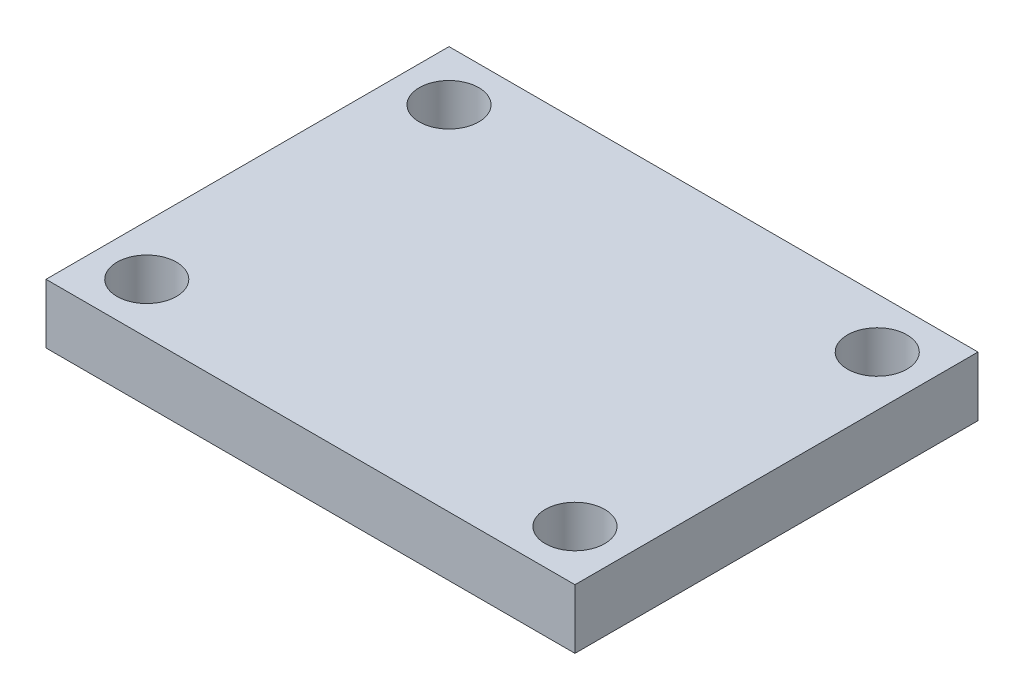
ISO-10303-21;
HEADER;
FILE_DESCRIPTION(('STEP AP214'),'2;1');
FILE_NAME('part.step','',(''),(''),'','','');
FILE_SCHEMA(('AUTOMOTIVE_DESIGN { 1 0 10303 214 1 1 1 1 }'));
ENDSEC;
DATA;
#1=APPLICATION_CONTEXT('core data for automotive mechanical design processes');
#2=APPLICATION_PROTOCOL_DEFINITION('international standard','automotive_design',2000,#1);
#3=PRODUCT_CONTEXT('',#1,'mechanical');
#4=PRODUCT('Part','Part','',(#3));
#5=PRODUCT_RELATED_PRODUCT_CATEGORY('part','',(#4));
#6=PRODUCT_DEFINITION_FORMATION('','',#4);
#7=PRODUCT_DEFINITION_CONTEXT('part definition',#1,'design');
#8=PRODUCT_DEFINITION('design','',#6,#7);
#9=PRODUCT_DEFINITION_SHAPE('','',#8);
#10=(LENGTH_UNIT() NAMED_UNIT(*) SI_UNIT(.MILLI.,.METRE.));
#11=(NAMED_UNIT(*) PLANE_ANGLE_UNIT() SI_UNIT($,.RADIAN.));
#12=(NAMED_UNIT(*) SI_UNIT($,.STERADIAN.) SOLID_ANGLE_UNIT());
#13=UNCERTAINTY_MEASURE_WITH_UNIT(LENGTH_MEASURE(1.E-05),#10,'distance_accuracy_value','');
#14=(GEOMETRIC_REPRESENTATION_CONTEXT(3) GLOBAL_UNCERTAINTY_ASSIGNED_CONTEXT((#13)) GLOBAL_UNIT_ASSIGNED_CONTEXT((#10,
#11,#12)) REPRESENTATION_CONTEXT('',''));
#15=CARTESIAN_POINT('',(0.,0.,0.));
#16=DIRECTION('',(0.,0.,1.));
#17=DIRECTION('',(1.,0.,0.));
#18=AXIS2_PLACEMENT_3D('',#15,#16,#17);
#19=CARTESIAN_POINT('',(0.,3.,-20.32));
#20=DIRECTION('',(0.,0.,-1.));
#21=DIRECTION('',(-1.,0.,0.));
#22=AXIS2_PLACEMENT_3D('',#19,#20,#21);
#23=PLANE('',#22);
#24=DIRECTION('',(1.,0.,0.));
#25=VECTOR('',#24,1.);
#26=CARTESIAN_POINT('',(0.,0.,-20.32));
#27=LINE('',#26,#25);
#28=CARTESIAN_POINT('',(0.,0.,-20.32));
#29=VERTEX_POINT('',#28);
#30=CARTESIAN_POINT('',(26.67,0.,-20.32));
#31=VERTEX_POINT('',#30);
#32=EDGE_CURVE('E98',#29,#31,#27,.T.);
#33=ORIENTED_EDGE('',*,*,#32,.F.);
#34=DIRECTION('',(0.,-1.,0.));
#35=VECTOR('',#34,1.);
#36=CARTESIAN_POINT('',(0.,3.,-20.32));
#37=LINE('',#36,#35);
#38=CARTESIAN_POINT('',(0.,3.,-20.32));
#39=VERTEX_POINT('',#38);
#40=EDGE_CURVE('E11',#39,#29,#37,.T.);
#41=ORIENTED_EDGE('',*,*,#40,.F.);
#42=DIRECTION('',(1.,0.,0.));
#43=VECTOR('',#42,1.);
#44=CARTESIAN_POINT('',(0.,3.,-20.32));
#45=LINE('',#44,#43);
#46=CARTESIAN_POINT('',(26.67,3.,-20.32));
#47=VERTEX_POINT('',#46);
#48=EDGE_CURVE('E91',#39,#47,#45,.T.);
#49=ORIENTED_EDGE('',*,*,#48,.T.);
#50=DIRECTION('',(0.,-1.,0.));
#51=VECTOR('',#50,1.);
#52=CARTESIAN_POINT('',(26.67,3.,-20.32));
#53=LINE('',#52,#51);
#54=EDGE_CURVE('E36',#47,#31,#53,.T.);
#55=ORIENTED_EDGE('',*,*,#54,.T.);
#56=EDGE_LOOP('',(#33,#41,#49,#55));
#57=FACE_BOUND('',#56,.T.);
#58=ADVANCED_FACE('F33',(#57),#23,.T.);
#59=CARTESIAN_POINT('',(0.,3.,0.));
#60=DIRECTION('',(-1.,0.,0.));
#61=DIRECTION('',(0.,0.,1.));
#62=AXIS2_PLACEMENT_3D('',#59,#60,#61);
#63=PLANE('',#62);
#64=DIRECTION('',(0.,0.,-1.));
#65=VECTOR('',#64,1.);
#66=CARTESIAN_POINT('',(0.,0.,0.));
#67=LINE('',#66,#65);
#68=CARTESIAN_POINT('',(0.,0.,0.));
#69=VERTEX_POINT('',#68);
#70=EDGE_CURVE('E93',#69,#29,#67,.T.);
#71=ORIENTED_EDGE('',*,*,#70,.F.);
#72=DIRECTION('',(0.,-1.,0.));
#73=VECTOR('',#72,1.);
#74=CARTESIAN_POINT('',(0.,3.,0.));
#75=LINE('',#74,#73);
#76=CARTESIAN_POINT('',(0.,3.,0.));
#77=VERTEX_POINT('',#76);
#78=EDGE_CURVE('E42',#77,#69,#75,.T.);
#79=ORIENTED_EDGE('',*,*,#78,.F.);
#80=DIRECTION('',(0.,0.,-1.));
#81=VECTOR('',#80,1.);
#82=CARTESIAN_POINT('',(0.,3.,0.));
#83=LINE('',#82,#81);
#84=EDGE_CURVE('E81',#77,#39,#83,.T.);
#85=ORIENTED_EDGE('',*,*,#84,.T.);
#86=ORIENTED_EDGE('',*,*,#40,.T.);
#87=EDGE_LOOP('',(#71,#79,#85,#86));
#88=FACE_BOUND('',#87,.T.);
#89=ADVANCED_FACE('F109',(#88),#63,.T.);
#90=CARTESIAN_POINT('',(0.,3.,0.));
#91=DIRECTION('',(0.,0.,-1.));
#92=DIRECTION('',(-1.,0.,0.));
#93=AXIS2_PLACEMENT_3D('',#90,#91,#92);
#94=PLANE('',#93);
#95=DIRECTION('',(1.,0.,0.));
#96=VECTOR('',#95,1.);
#97=CARTESIAN_POINT('',(0.,0.,0.));
#98=LINE('',#97,#96);
#99=CARTESIAN_POINT('',(26.67,0.,0.));
#100=VERTEX_POINT('',#99);
#101=EDGE_CURVE('E86',#69,#100,#98,.T.);
#102=ORIENTED_EDGE('',*,*,#101,.T.);
#103=DIRECTION('',(0.,-1.,0.));
#104=VECTOR('',#103,1.);
#105=CARTESIAN_POINT('',(26.67,3.,0.));
#106=LINE('',#105,#104);
#107=CARTESIAN_POINT('',(26.67,3.,0.));
#108=VERTEX_POINT('',#107);
#109=EDGE_CURVE('E84',#108,#100,#106,.T.);
#110=ORIENTED_EDGE('',*,*,#109,.F.);
#111=DIRECTION('',(1.,0.,0.));
#112=VECTOR('',#111,1.);
#113=CARTESIAN_POINT('',(0.,3.,0.));
#114=LINE('',#113,#112);
#115=EDGE_CURVE('E78',#77,#108,#114,.T.);
#116=ORIENTED_EDGE('',*,*,#115,.F.);
#117=ORIENTED_EDGE('',*,*,#78,.T.);
#118=EDGE_LOOP('',(#102,#110,#116,#117));
#119=FACE_BOUND('',#118,.T.);
#120=ADVANCED_FACE('F85',(#119),#94,.F.);
#121=CARTESIAN_POINT('',(26.67,3.,0.));
#122=DIRECTION('',(-1.,0.,0.));
#123=DIRECTION('',(0.,0.,1.));
#124=AXIS2_PLACEMENT_3D('',#121,#122,#123);
#125=PLANE('',#124);
#126=DIRECTION('',(0.,0.,-1.));
#127=VECTOR('',#126,1.);
#128=CARTESIAN_POINT('',(26.67,0.,0.));
#129=LINE('',#128,#127);
#130=EDGE_CURVE('E101',#100,#31,#129,.T.);
#131=ORIENTED_EDGE('',*,*,#130,.T.);
#132=ORIENTED_EDGE('',*,*,#54,.F.);
#133=DIRECTION('',(0.,0.,-1.));
#134=VECTOR('',#133,1.);
#135=CARTESIAN_POINT('',(26.67,3.,0.));
#136=LINE('',#135,#134);
#137=EDGE_CURVE('E75',#108,#47,#136,.T.);
#138=ORIENTED_EDGE('',*,*,#137,.F.);
#139=ORIENTED_EDGE('',*,*,#109,.T.);
#140=EDGE_LOOP('',(#131,#132,#138,#139));
#141=FACE_BOUND('',#140,.T.);
#142=ADVANCED_FACE('F90',(#141),#125,.F.);
#143=CARTESIAN_POINT('',(0.,3.,0.));
#144=DIRECTION('',(0.,1.,0.));
#145=DIRECTION('',(0.,0.,1.));
#146=AXIS2_PLACEMENT_3D('',#143,#144,#145);
#147=PLANE('',#146);
#148=CARTESIAN_POINT('',(24.13,3.,-17.78));
#149=DIRECTION('',(0.,1.,0.));
#150=DIRECTION('',(0.,0.,1.));
#151=AXIS2_PLACEMENT_3D('',#148,#149,#150);
#152=CIRCLE('',#151,1.5);
#153=CARTESIAN_POINT('',(24.13,3.,-16.28));
#154=VERTEX_POINT('',#153);
#155=EDGE_CURVE('E169',#154,#154,#152,.T.);
#156=ORIENTED_EDGE('',*,*,#155,.F.);
#157=EDGE_LOOP('',(#156));
#158=FACE_BOUND('',#157,.T.);
#159=CARTESIAN_POINT('',(2.54,3.,-17.78));
#160=DIRECTION('',(0.,1.,0.));
#161=DIRECTION('',(0.,0.,1.));
#162=AXIS2_PLACEMENT_3D('',#159,#160,#161);
#163=CIRCLE('',#162,1.5);
#164=CARTESIAN_POINT('',(2.54,3.,-16.28));
#165=VERTEX_POINT('',#164);
#166=EDGE_CURVE('E161',#165,#165,#163,.T.);
#167=ORIENTED_EDGE('',*,*,#166,.F.);
#168=EDGE_LOOP('',(#167));
#169=FACE_BOUND('',#168,.T.);
#170=CARTESIAN_POINT('',(2.54,3.,-2.54));
#171=DIRECTION('',(0.,1.,0.));
#172=DIRECTION('',(0.,0.,1.));
#173=AXIS2_PLACEMENT_3D('',#170,#171,#172);
#174=CIRCLE('',#173,1.5);
#175=CARTESIAN_POINT('',(2.54,3.,-1.04));
#176=VERTEX_POINT('',#175);
#177=EDGE_CURVE('E154',#176,#176,#174,.T.);
#178=ORIENTED_EDGE('',*,*,#177,.F.);
#179=EDGE_LOOP('',(#178));
#180=FACE_BOUND('',#179,.T.);
#181=CARTESIAN_POINT('',(24.13,3.,-2.54));
#182=DIRECTION('',(0.,1.,0.));
#183=DIRECTION('',(0.,0.,1.));
#184=AXIS2_PLACEMENT_3D('',#181,#182,#183);
#185=CIRCLE('',#184,1.5);
#186=CARTESIAN_POINT('',(24.13,3.,-1.04));
#187=VERTEX_POINT('',#186);
#188=EDGE_CURVE('E158',#187,#187,#185,.T.);
#189=ORIENTED_EDGE('',*,*,#188,.F.);
#190=EDGE_LOOP('',(#189));
#191=FACE_BOUND('',#190,.T.);
#192=ORIENTED_EDGE('',*,*,#48,.F.);
#193=ORIENTED_EDGE('',*,*,#84,.F.);
#194=ORIENTED_EDGE('',*,*,#115,.T.);
#195=ORIENTED_EDGE('',*,*,#137,.T.);
#196=EDGE_LOOP('',(#192,#193,#194,#195));
#197=FACE_BOUND('',#196,.T.);
#198=ADVANCED_FACE('F80',(#158,#169,#180,#191,#197),#147,.T.);
#199=CARTESIAN_POINT('',(0.,0.,0.));
#200=DIRECTION('',(0.,1.,0.));
#201=DIRECTION('',(0.,0.,1.));
#202=AXIS2_PLACEMENT_3D('',#199,#200,#201);
#203=PLANE('',#202);
#204=CARTESIAN_POINT('',(24.13,0.,-17.78));
#205=DIRECTION('',(0.,1.,0.));
#206=DIRECTION('',(0.,0.,1.));
#207=AXIS2_PLACEMENT_3D('',#204,#205,#206);
#208=CIRCLE('',#207,1.5);
#209=CARTESIAN_POINT('',(24.13,0.,-16.28));
#210=VERTEX_POINT('',#209);
#211=EDGE_CURVE('E166',#210,#210,#208,.T.);
#212=ORIENTED_EDGE('',*,*,#211,.T.);
#213=EDGE_LOOP('',(#212));
#214=FACE_BOUND('',#213,.T.);
#215=CARTESIAN_POINT('',(2.54,0.,-17.78));
#216=DIRECTION('',(0.,1.,0.));
#217=DIRECTION('',(0.,0.,1.));
#218=AXIS2_PLACEMENT_3D('',#215,#216,#217);
#219=CIRCLE('',#218,1.5);
#220=CARTESIAN_POINT('',(2.54,0.,-16.28));
#221=VERTEX_POINT('',#220);
#222=EDGE_CURVE('E156',#221,#221,#219,.T.);
#223=ORIENTED_EDGE('',*,*,#222,.T.);
#224=EDGE_LOOP('',(#223));
#225=FACE_BOUND('',#224,.T.);
#226=CARTESIAN_POINT('',(2.54,0.,-2.54));
#227=DIRECTION('',(0.,1.,0.));
#228=DIRECTION('',(0.,0.,1.));
#229=AXIS2_PLACEMENT_3D('',#226,#227,#228);
#230=CIRCLE('',#229,1.5);
#231=CARTESIAN_POINT('',(2.54,0.,-1.04));
#232=VERTEX_POINT('',#231);
#233=EDGE_CURVE('E151',#232,#232,#230,.T.);
#234=ORIENTED_EDGE('',*,*,#233,.T.);
#235=EDGE_LOOP('',(#234));
#236=FACE_BOUND('',#235,.T.);
#237=CARTESIAN_POINT('',(24.13,0.,-2.54));
#238=DIRECTION('',(0.,1.,0.));
#239=DIRECTION('',(0.,0.,1.));
#240=AXIS2_PLACEMENT_3D('',#237,#238,#239);
#241=CIRCLE('',#240,1.5);
#242=CARTESIAN_POINT('',(24.13,0.,-1.04));
#243=VERTEX_POINT('',#242);
#244=EDGE_CURVE('E102',#243,#243,#241,.T.);
#245=ORIENTED_EDGE('',*,*,#244,.T.);
#246=EDGE_LOOP('',(#245));
#247=FACE_BOUND('',#246,.T.);
#248=ORIENTED_EDGE('',*,*,#32,.T.);
#249=ORIENTED_EDGE('',*,*,#130,.F.);
#250=ORIENTED_EDGE('',*,*,#101,.F.);
#251=ORIENTED_EDGE('',*,*,#70,.T.);
#252=EDGE_LOOP('',(#248,#249,#250,#251));
#253=FACE_BOUND('',#252,.T.);
#254=ADVANCED_FACE('F108',(#214,#225,#236,#247,#253),#203,.F.);
#255=CARTESIAN_POINT('',(24.13,0.,-2.54));
#256=DIRECTION('',(0.,1.,0.));
#257=DIRECTION('',(0.,0.,1.));
#258=AXIS2_PLACEMENT_3D('',#255,#256,#257);
#259=CYLINDRICAL_SURFACE('',#258,1.5);
#260=ORIENTED_EDGE('',*,*,#244,.F.);
#261=EDGE_LOOP('',(#260));
#262=FACE_BOUND('',#261,.T.);
#263=ORIENTED_EDGE('',*,*,#188,.T.);
#264=EDGE_LOOP('',(#263));
#265=FACE_BOUND('',#264,.T.);
#266=ADVANCED_FACE('F127',(#262,#265),#259,.F.);
#267=CARTESIAN_POINT('',(2.54,0.,-2.54));
#268=DIRECTION('',(0.,1.,0.));
#269=DIRECTION('',(0.,0.,1.));
#270=AXIS2_PLACEMENT_3D('',#267,#268,#269);
#271=CYLINDRICAL_SURFACE('',#270,1.5);
#272=ORIENTED_EDGE('',*,*,#233,.F.);
#273=EDGE_LOOP('',(#272));
#274=FACE_BOUND('',#273,.T.);
#275=ORIENTED_EDGE('',*,*,#177,.T.);
#276=EDGE_LOOP('',(#275));
#277=FACE_BOUND('',#276,.T.);
#278=ADVANCED_FACE('F134',(#274,#277),#271,.F.);
#279=CARTESIAN_POINT('',(2.54,0.,-17.78));
#280=DIRECTION('',(0.,1.,0.));
#281=DIRECTION('',(0.,0.,1.));
#282=AXIS2_PLACEMENT_3D('',#279,#280,#281);
#283=CYLINDRICAL_SURFACE('',#282,1.5);
#284=ORIENTED_EDGE('',*,*,#222,.F.);
#285=EDGE_LOOP('',(#284));
#286=FACE_BOUND('',#285,.T.);
#287=ORIENTED_EDGE('',*,*,#166,.T.);
#288=EDGE_LOOP('',(#287));
#289=FACE_BOUND('',#288,.T.);
#290=ADVANCED_FACE('F139',(#286,#289),#283,.F.);
#291=CARTESIAN_POINT('',(24.13,0.,-17.78));
#292=DIRECTION('',(0.,1.,0.));
#293=DIRECTION('',(0.,0.,1.));
#294=AXIS2_PLACEMENT_3D('',#291,#292,#293);
#295=CYLINDRICAL_SURFACE('',#294,1.5);
#296=ORIENTED_EDGE('',*,*,#211,.F.);
#297=EDGE_LOOP('',(#296));
#298=FACE_BOUND('',#297,.T.);
#299=ORIENTED_EDGE('',*,*,#155,.T.);
#300=EDGE_LOOP('',(#299));
#301=FACE_BOUND('',#300,.T.);
#302=ADVANCED_FACE('F136',(#298,#301),#295,.F.);
#303=CLOSED_SHELL('',(#58,#89,#120,#142,#198,#254,#266,#278,#290,#302));
#304=MANIFOLD_SOLID_BREP('B2',#303);
#305=ADVANCED_BREP_SHAPE_REPRESENTATION('',(#18,#304),#14);
#306=SHAPE_DEFINITION_REPRESENTATION(#9,#305);
ENDSEC;
END-ISO-10303-21;
